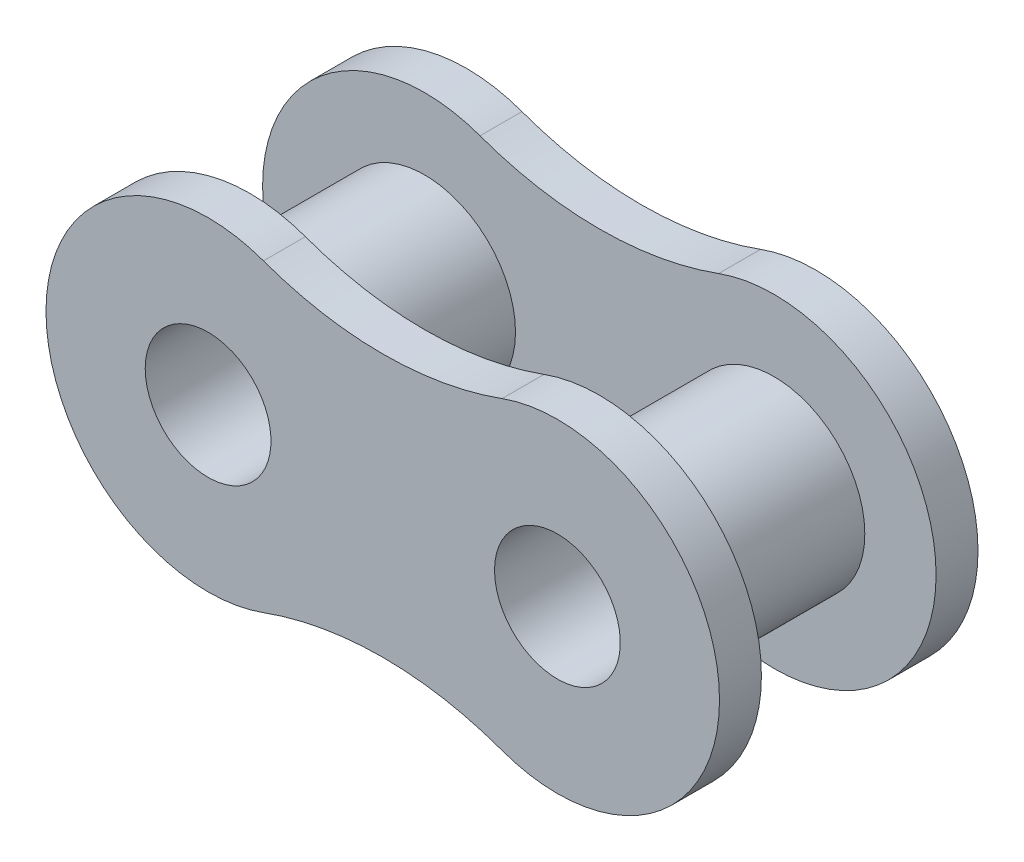
ISO-10303-21;
HEADER;
FILE_DESCRIPTION(('STEP AP214'),'2;1');
FILE_NAME('part.step','',(''),(''),'','','');
FILE_SCHEMA(('AUTOMOTIVE_DESIGN { 1 0 10303 214 1 1 1 1 }'));
ENDSEC;
DATA;
#1=APPLICATION_CONTEXT('core data for automotive mechanical design processes');
#2=APPLICATION_PROTOCOL_DEFINITION('international standard','automotive_design',2000,#1);
#3=PRODUCT_CONTEXT('',#1,'mechanical');
#4=PRODUCT('Part','Part','',(#3));
#5=PRODUCT_RELATED_PRODUCT_CATEGORY('part','',(#4));
#6=PRODUCT_DEFINITION_FORMATION('','',#4);
#7=PRODUCT_DEFINITION_CONTEXT('part definition',#1,'design');
#8=PRODUCT_DEFINITION('design','',#6,#7);
#9=PRODUCT_DEFINITION_SHAPE('','',#8);
#10=(LENGTH_UNIT() NAMED_UNIT(*) SI_UNIT(.MILLI.,.METRE.));
#11=(NAMED_UNIT(*) PLANE_ANGLE_UNIT() SI_UNIT($,.RADIAN.));
#12=(NAMED_UNIT(*) SI_UNIT($,.STERADIAN.) SOLID_ANGLE_UNIT());
#13=UNCERTAINTY_MEASURE_WITH_UNIT(LENGTH_MEASURE(1.E-05),#10,'distance_accuracy_value','');
#14=(GEOMETRIC_REPRESENTATION_CONTEXT(3) GLOBAL_UNCERTAINTY_ASSIGNED_CONTEXT((#13)) GLOBAL_UNIT_ASSIGNED_CONTEXT((#10,
#11,#12)) REPRESENTATION_CONTEXT('',''));
#15=CARTESIAN_POINT('',(0.,0.,0.));
#16=DIRECTION('',(0.,0.,1.));
#17=DIRECTION('',(1.,0.,0.));
#18=AXIS2_PLACEMENT_3D('',#15,#16,#17);
#19=CARTESIAN_POINT('',(-4.7625,-4.36870770251341,1.5875));
#20=DIRECTION('',(0.,0.,1.));
#21=DIRECTION('',(1.,0.,0.));
#22=AXIS2_PLACEMENT_3D('',#19,#20,#21);
#23=PLANE('',#22);
#24=CARTESIAN_POINT('',(0.,0.,1.5875));
#25=DIRECTION('',(0.,0.,1.));
#26=DIRECTION('',(1.,0.,0.));
#27=AXIS2_PLACEMENT_3D('',#24,#25,#26);
#28=CIRCLE('',#27,1.651);
#29=CARTESIAN_POINT('',(1.651,0.,1.5875));
#30=VERTEX_POINT('',#29);
#31=EDGE_CURVE('E221',#30,#30,#28,.F.);
#32=ORIENTED_EDGE('',*,*,#31,.F.);
#33=EDGE_LOOP('',(#32));
#34=FACE_BOUND('',#33,.T.);
#35=CARTESIAN_POINT('',(-3.175,-8.73741540502682,1.5875));
#36=DIRECTION('',(0.,0.,-1.));
#37=DIRECTION('',(1.,0.,0.));
#38=AXIS2_PLACEMENT_3D('',#35,#36,#37);
#39=CIRCLE('',#38,6.35);
#40=CARTESIAN_POINT('',(-5.34371584699454,-2.76923548356041,1.5875));
#41=VERTEX_POINT('',#40);
#42=CARTESIAN_POINT('',(-1.00628415300546,-2.76923548356041,1.5875));
#43=VERTEX_POINT('',#42);
#44=EDGE_CURVE('E188',#41,#43,#39,.T.);
#45=ORIENTED_EDGE('',*,*,#44,.F.);
#46=CARTESIAN_POINT('',(-6.35,0.,1.5875));
#47=DIRECTION('',(0.,0.,1.));
#48=DIRECTION('',(1.,0.,0.));
#49=AXIS2_PLACEMENT_3D('',#46,#47,#48);
#50=CIRCLE('',#49,2.9464);
#51=CARTESIAN_POINT('',(-5.34371584699454,2.76923548356041,1.5875));
#52=VERTEX_POINT('',#51);
#53=EDGE_CURVE('E83',#52,#41,#50,.T.);
#54=ORIENTED_EDGE('',*,*,#53,.F.);
#55=CARTESIAN_POINT('',(-3.175,8.73741540502682,1.5875));
#56=DIRECTION('',(0.,0.,-1.));
#57=DIRECTION('',(1.,0.,0.));
#58=AXIS2_PLACEMENT_3D('',#55,#56,#57);
#59=CIRCLE('',#58,6.35);
#60=CARTESIAN_POINT('',(-1.00628415300547,2.76923548356041,1.5875));
#61=VERTEX_POINT('',#60);
#62=EDGE_CURVE('E77',#61,#52,#59,.T.);
#63=ORIENTED_EDGE('',*,*,#62,.F.);
#64=CARTESIAN_POINT('',(0.,0.,1.5875));
#65=DIRECTION('',(0.,0.,1.));
#66=DIRECTION('',(1.,0.,0.));
#67=AXIS2_PLACEMENT_3D('',#64,#65,#66);
#68=CIRCLE('',#67,2.9464);
#69=EDGE_CURVE('E203',#43,#61,#68,.T.);
#70=ORIENTED_EDGE('',*,*,#69,.F.);
#71=EDGE_LOOP('',(#45,#54,#63,#70));
#72=FACE_BOUND('',#71,.T.);
#73=CARTESIAN_POINT('',(-6.35,0.,1.5875));
#74=DIRECTION('',(0.,0.,1.));
#75=DIRECTION('',(1.,0.,0.));
#76=AXIS2_PLACEMENT_3D('',#73,#74,#75);
#77=CIRCLE('',#76,1.651);
#78=CARTESIAN_POINT('',(-4.699,0.,1.5875));
#79=VERTEX_POINT('',#78);
#80=EDGE_CURVE('E11',#79,#79,#77,.F.);
#81=ORIENTED_EDGE('',*,*,#80,.F.);
#82=EDGE_LOOP('',(#81));
#83=FACE_BOUND('',#82,.T.);
#84=ADVANCED_FACE('F41',(#34,#72,#83),#23,.F.);
#85=CARTESIAN_POINT('',(-4.7625,-4.36870770251341,-1.5875));
#86=DIRECTION('',(0.,0.,-1.));
#87=DIRECTION('',(1.,0.,0.));
#88=AXIS2_PLACEMENT_3D('',#85,#86,#87);
#89=PLANE('',#88);
#90=CARTESIAN_POINT('',(0.,0.,-1.5875));
#91=DIRECTION('',(0.,0.,-1.));
#92=DIRECTION('',(-1.,0.,0.));
#93=AXIS2_PLACEMENT_3D('',#90,#91,#92);
#94=CIRCLE('',#93,1.651);
#95=CARTESIAN_POINT('',(-1.651,0.,-1.5875));
#96=VERTEX_POINT('',#95);
#97=EDGE_CURVE('E130',#96,#96,#94,.T.);
#98=ORIENTED_EDGE('',*,*,#97,.T.);
#99=EDGE_LOOP('',(#98));
#100=FACE_BOUND('',#99,.T.);
#101=CARTESIAN_POINT('',(-3.175,-8.73741540502682,-1.5875));
#102=DIRECTION('',(0.,0.,-1.));
#103=DIRECTION('',(1.,0.,0.));
#104=AXIS2_PLACEMENT_3D('',#101,#102,#103);
#105=CIRCLE('',#104,6.35);
#106=CARTESIAN_POINT('',(-5.34371584699454,-2.76923548356041,-1.5875));
#107=VERTEX_POINT('',#106);
#108=CARTESIAN_POINT('',(-1.00628415300546,-2.76923548356041,-1.5875));
#109=VERTEX_POINT('',#108);
#110=EDGE_CURVE('E162',#107,#109,#105,.T.);
#111=ORIENTED_EDGE('',*,*,#110,.T.);
#112=CARTESIAN_POINT('',(0.,0.,-1.5875));
#113=DIRECTION('',(0.,0.,1.));
#114=DIRECTION('',(1.,0.,0.));
#115=AXIS2_PLACEMENT_3D('',#112,#113,#114);
#116=CIRCLE('',#115,2.9464);
#117=CARTESIAN_POINT('',(-1.00628415300547,2.76923548356041,-1.5875));
#118=VERTEX_POINT('',#117);
#119=EDGE_CURVE('E124',#109,#118,#116,.T.);
#120=ORIENTED_EDGE('',*,*,#119,.T.);
#121=CARTESIAN_POINT('',(-3.175,8.73741540502682,-1.5875));
#122=DIRECTION('',(0.,0.,-1.));
#123=DIRECTION('',(1.,0.,0.));
#124=AXIS2_PLACEMENT_3D('',#121,#122,#123);
#125=CIRCLE('',#124,6.35);
#126=CARTESIAN_POINT('',(-5.34371584699454,2.76923548356041,-1.5875));
#127=VERTEX_POINT('',#126);
#128=EDGE_CURVE('E151',#118,#127,#125,.T.);
#129=ORIENTED_EDGE('',*,*,#128,.T.);
#130=CARTESIAN_POINT('',(-6.35,0.,-1.5875));
#131=DIRECTION('',(0.,0.,1.));
#132=DIRECTION('',(1.,0.,0.));
#133=AXIS2_PLACEMENT_3D('',#130,#131,#132);
#134=CIRCLE('',#133,2.9464);
#135=EDGE_CURVE('E147',#127,#107,#134,.T.);
#136=ORIENTED_EDGE('',*,*,#135,.T.);
#137=EDGE_LOOP('',(#111,#120,#129,#136));
#138=FACE_BOUND('',#137,.T.);
#139=CARTESIAN_POINT('',(-6.35,0.,-1.5875));
#140=DIRECTION('',(0.,0.,-1.));
#141=DIRECTION('',(-1.,0.,0.));
#142=AXIS2_PLACEMENT_3D('',#139,#140,#141);
#143=CIRCLE('',#142,1.651);
#144=CARTESIAN_POINT('',(-8.001,0.,-1.5875));
#145=VERTEX_POINT('',#144);
#146=EDGE_CURVE('E51',#145,#145,#143,.F.);
#147=ORIENTED_EDGE('',*,*,#146,.F.);
#148=EDGE_LOOP('',(#147));
#149=FACE_BOUND('',#148,.T.);
#150=ADVANCED_FACE('F230',(#100,#138,#149),#89,.F.);
#151=CARTESIAN_POINT('',(-4.7625,-4.36870770251341,2.3495));
#152=DIRECTION('',(0.,0.,1.));
#153=DIRECTION('',(1.,0.,0.));
#154=AXIS2_PLACEMENT_3D('',#151,#152,#153);
#155=PLANE('',#154);
#156=CARTESIAN_POINT('',(0.,0.,2.3495));
#157=DIRECTION('',(0.,0.,1.));
#158=DIRECTION('',(1.,0.,0.));
#159=AXIS2_PLACEMENT_3D('',#156,#157,#158);
#160=CIRCLE('',#159,1.143);
#161=CARTESIAN_POINT('',(-1.143,0.,2.3495));
#162=VERTEX_POINT('',#161);
#163=EDGE_CURVE('E184',#162,#162,#160,.T.);
#164=ORIENTED_EDGE('',*,*,#163,.F.);
#165=EDGE_LOOP('',(#164));
#166=FACE_BOUND('',#165,.T.);
#167=CARTESIAN_POINT('',(-3.175,-8.73741540502682,2.3495));
#168=DIRECTION('',(0.,0.,-1.));
#169=DIRECTION('',(1.,0.,0.));
#170=AXIS2_PLACEMENT_3D('',#167,#168,#169);
#171=CIRCLE('',#170,6.35);
#172=CARTESIAN_POINT('',(-5.34371584699454,-2.76923548356041,2.3495));
#173=VERTEX_POINT('',#172);
#174=CARTESIAN_POINT('',(-1.00628415300546,-2.76923548356041,2.3495));
#175=VERTEX_POINT('',#174);
#176=EDGE_CURVE('E189',#173,#175,#171,.T.);
#177=ORIENTED_EDGE('',*,*,#176,.T.);
#178=CARTESIAN_POINT('',(0.,0.,2.3495));
#179=DIRECTION('',(0.,0.,1.));
#180=DIRECTION('',(1.,0.,0.));
#181=AXIS2_PLACEMENT_3D('',#178,#179,#180);
#182=CIRCLE('',#181,2.9464);
#183=CARTESIAN_POINT('',(-1.00628415300547,2.76923548356041,2.3495));
#184=VERTEX_POINT('',#183);
#185=EDGE_CURVE('E91',#175,#184,#182,.T.);
#186=ORIENTED_EDGE('',*,*,#185,.T.);
#187=CARTESIAN_POINT('',(-3.175,8.73741540502682,2.3495));
#188=DIRECTION('',(0.,0.,-1.));
#189=DIRECTION('',(1.,0.,0.));
#190=AXIS2_PLACEMENT_3D('',#187,#188,#189);
#191=CIRCLE('',#190,6.35);
#192=CARTESIAN_POINT('',(-5.34371584699454,2.76923548356041,2.3495));
#193=VERTEX_POINT('',#192);
#194=EDGE_CURVE('E194',#184,#193,#191,.T.);
#195=ORIENTED_EDGE('',*,*,#194,.T.);
#196=CARTESIAN_POINT('',(-6.35,0.,2.3495));
#197=DIRECTION('',(0.,0.,1.));
#198=DIRECTION('',(1.,0.,0.));
#199=AXIS2_PLACEMENT_3D('',#196,#197,#198);
#200=CIRCLE('',#199,2.9464);
#201=EDGE_CURVE('E59',#193,#173,#200,.T.);
#202=ORIENTED_EDGE('',*,*,#201,.T.);
#203=EDGE_LOOP('',(#177,#186,#195,#202));
#204=FACE_BOUND('',#203,.T.);
#205=CARTESIAN_POINT('',(-6.35,0.,2.3495));
#206=DIRECTION('',(0.,0.,1.));
#207=DIRECTION('',(1.,0.,0.));
#208=AXIS2_PLACEMENT_3D('',#205,#206,#207);
#209=CIRCLE('',#208,1.143);
#210=CARTESIAN_POINT('',(-7.493,0.,2.3495));
#211=VERTEX_POINT('',#210);
#212=EDGE_CURVE('E180',#211,#211,#209,.T.);
#213=ORIENTED_EDGE('',*,*,#212,.F.);
#214=EDGE_LOOP('',(#213));
#215=FACE_BOUND('',#214,.T.);
#216=ADVANCED_FACE('F232',(#166,#204,#215),#155,.T.);
#217=CARTESIAN_POINT('',(-3.175,-8.73741540502682,2.3495));
#218=DIRECTION('',(0.,0.,-1.));
#219=DIRECTION('',(-1.,0.,0.));
#220=AXIS2_PLACEMENT_3D('',#217,#218,#219);
#221=CYLINDRICAL_SURFACE('',#220,6.35);
#222=ORIENTED_EDGE('',*,*,#44,.T.);
#223=DIRECTION('',(0.,0.,-1.));
#224=VECTOR('',#223,1.);
#225=CARTESIAN_POINT('',(-1.00628415300546,-2.76923548356041,2.3495));
#226=LINE('',#225,#224);
#227=EDGE_CURVE('E218',#175,#43,#226,.T.);
#228=ORIENTED_EDGE('',*,*,#227,.F.);
#229=ORIENTED_EDGE('',*,*,#176,.F.);
#230=DIRECTION('',(0.,0.,-1.));
#231=VECTOR('',#230,1.);
#232=CARTESIAN_POINT('',(-5.34371584699454,-2.76923548356041,2.3495));
#233=LINE('',#232,#231);
#234=EDGE_CURVE('E199',#173,#41,#233,.T.);
#235=ORIENTED_EDGE('',*,*,#234,.T.);
#236=EDGE_LOOP('',(#222,#228,#229,#235));
#237=FACE_BOUND('',#236,.T.);
#238=ADVANCED_FACE('F43',(#237),#221,.F.);
#239=CARTESIAN_POINT('',(0.,0.,2.3495));
#240=DIRECTION('',(0.,0.,-1.));
#241=DIRECTION('',(-1.,0.,0.));
#242=AXIS2_PLACEMENT_3D('',#239,#240,#241);
#243=CYLINDRICAL_SURFACE('',#242,2.9464);
#244=ORIENTED_EDGE('',*,*,#69,.T.);
#245=DIRECTION('',(0.,0.,-1.));
#246=VECTOR('',#245,1.);
#247=CARTESIAN_POINT('',(-1.00628415300547,2.76923548356041,2.3495));
#248=LINE('',#247,#246);
#249=EDGE_CURVE('E215',#184,#61,#248,.T.);
#250=ORIENTED_EDGE('',*,*,#249,.F.);
#251=ORIENTED_EDGE('',*,*,#185,.F.);
#252=ORIENTED_EDGE('',*,*,#227,.T.);
#253=EDGE_LOOP('',(#244,#250,#251,#252));
#254=FACE_BOUND('',#253,.T.);
#255=ADVANCED_FACE('F276',(#254),#243,.T.);
#256=CARTESIAN_POINT('',(-3.175,8.73741540502682,2.3495));
#257=DIRECTION('',(0.,0.,-1.));
#258=DIRECTION('',(-1.,0.,0.));
#259=AXIS2_PLACEMENT_3D('',#256,#257,#258);
#260=CYLINDRICAL_SURFACE('',#259,6.35);
#261=ORIENTED_EDGE('',*,*,#62,.T.);
#262=DIRECTION('',(0.,0.,-1.));
#263=VECTOR('',#262,1.);
#264=CARTESIAN_POINT('',(-5.34371584699454,2.76923548356041,2.3495));
#265=LINE('',#264,#263);
#266=EDGE_CURVE('E212',#193,#52,#265,.T.);
#267=ORIENTED_EDGE('',*,*,#266,.F.);
#268=ORIENTED_EDGE('',*,*,#194,.F.);
#269=ORIENTED_EDGE('',*,*,#249,.T.);
#270=EDGE_LOOP('',(#261,#267,#268,#269));
#271=FACE_BOUND('',#270,.T.);
#272=ADVANCED_FACE('F274',(#271),#260,.F.);
#273=CARTESIAN_POINT('',(-6.35,0.,2.3495));
#274=DIRECTION('',(0.,0.,-1.));
#275=DIRECTION('',(-1.,0.,0.));
#276=AXIS2_PLACEMENT_3D('',#273,#274,#275);
#277=CYLINDRICAL_SURFACE('',#276,2.9464);
#278=ORIENTED_EDGE('',*,*,#53,.T.);
#279=ORIENTED_EDGE('',*,*,#234,.F.);
#280=ORIENTED_EDGE('',*,*,#201,.F.);
#281=ORIENTED_EDGE('',*,*,#266,.T.);
#282=EDGE_LOOP('',(#278,#279,#280,#281));
#283=FACE_BOUND('',#282,.T.);
#284=ADVANCED_FACE('F269',(#283),#277,.T.);
#285=CARTESIAN_POINT('',(0.,0.,2.3495));
#286=DIRECTION('',(0.,0.,-1.));
#287=DIRECTION('',(-1.,0.,0.));
#288=AXIS2_PLACEMENT_3D('',#285,#286,#287);
#289=CYLINDRICAL_SURFACE('',#288,1.143);
#290=CARTESIAN_POINT('',(0.,0.,-2.3495));
#291=DIRECTION('',(0.,0.,1.));
#292=DIRECTION('',(1.,0.,0.));
#293=AXIS2_PLACEMENT_3D('',#290,#291,#292);
#294=CIRCLE('',#293,1.143);
#295=CARTESIAN_POINT('',(-1.143,0.,-2.3495));
#296=VERTEX_POINT('',#295);
#297=EDGE_CURVE('E154',#296,#296,#294,.T.);
#298=CARTESIAN_POINT('',(-1.143,0.,2.3495));
#299=CARTESIAN_POINT('',(-1.143,0.,2.30055208333333));
#300=CARTESIAN_POINT('',(-1.143,0.,2.25160416666667));
#301=CARTESIAN_POINT('',(-1.143,0.,2.15370833333333));
#302=CARTESIAN_POINT('',(-1.143,0.,2.10476041666667));
#303=CARTESIAN_POINT('',(-1.143,0.,2.00686458333333));
#304=CARTESIAN_POINT('',(-1.143,0.,1.95791666666667));
#305=CARTESIAN_POINT('',(-1.143,0.,1.86002083333333));
#306=CARTESIAN_POINT('',(-1.143,0.,1.81107291666667));
#307=CARTESIAN_POINT('',(-1.143,0.,1.71317708333333));
#308=CARTESIAN_POINT('',(-1.143,0.,1.66422916666667));
#309=CARTESIAN_POINT('',(-1.143,0.,1.56633333333333));
#310=CARTESIAN_POINT('',(-1.143,0.,1.51738541666667));
#311=CARTESIAN_POINT('',(-1.143,0.,1.41948958333333));
#312=CARTESIAN_POINT('',(-1.143,0.,1.37054166666667));
#313=CARTESIAN_POINT('',(-1.143,0.,1.27264583333333));
#314=CARTESIAN_POINT('',(-1.143,0.,1.22369791666667));
#315=CARTESIAN_POINT('',(-1.143,0.,1.12580208333333));
#316=CARTESIAN_POINT('',(-1.143,0.,1.07685416666667));
#317=CARTESIAN_POINT('',(-1.143,0.,0.978958333333333));
#318=CARTESIAN_POINT('',(-1.143,0.,0.930010416666666));
#319=CARTESIAN_POINT('',(-1.143,0.,0.832114583333333));
#320=CARTESIAN_POINT('',(-1.143,0.,0.783166666666666));
#321=CARTESIAN_POINT('',(-1.143,0.,0.685270833333333));
#322=CARTESIAN_POINT('',(-1.143,0.,0.636322916666666));
#323=CARTESIAN_POINT('',(-1.143,0.,0.538427083333333));
#324=CARTESIAN_POINT('',(-1.143,0.,0.489479166666666));
#325=CARTESIAN_POINT('',(-1.143,0.,0.391583333333333));
#326=CARTESIAN_POINT('',(-1.143,0.,0.342635416666666));
#327=CARTESIAN_POINT('',(-1.143,0.,0.244739583333333));
#328=CARTESIAN_POINT('',(-1.143,0.,0.195791666666666));
#329=CARTESIAN_POINT('',(-1.143,0.,0.0978958333333327));
#330=CARTESIAN_POINT('',(-1.143,0.,0.0489479166666659));
#331=CARTESIAN_POINT('',(-1.143,0.,-0.0489479166666676));
#332=CARTESIAN_POINT('',(-1.143,0.,-0.0978958333333344));
#333=CARTESIAN_POINT('',(-1.143,0.,-0.195791666666668));
#334=CARTESIAN_POINT('',(-1.143,0.,-0.244739583333334));
#335=CARTESIAN_POINT('',(-1.143,0.,-0.342635416666668));
#336=CARTESIAN_POINT('',(-1.143,0.,-0.391583333333334));
#337=CARTESIAN_POINT('',(-1.143,0.,-0.489479166666668));
#338=CARTESIAN_POINT('',(-1.143,0.,-0.538427083333334));
#339=CARTESIAN_POINT('',(-1.143,0.,-0.636322916666668));
#340=CARTESIAN_POINT('',(-1.143,0.,-0.685270833333335));
#341=CARTESIAN_POINT('',(-1.143,0.,-0.783166666666668));
#342=CARTESIAN_POINT('',(-1.143,0.,-0.832114583333335));
#343=CARTESIAN_POINT('',(-1.143,0.,-0.930010416666668));
#344=CARTESIAN_POINT('',(-1.143,0.,-0.978958333333334));
#345=CARTESIAN_POINT('',(-1.143,0.,-1.07685416666667));
#346=CARTESIAN_POINT('',(-1.143,0.,-1.12580208333333));
#347=CARTESIAN_POINT('',(-1.143,0.,-1.22369791666667));
#348=CARTESIAN_POINT('',(-1.143,0.,-1.27264583333333));
#349=CARTESIAN_POINT('',(-1.143,0.,-1.37054166666667));
#350=CARTESIAN_POINT('',(-1.143,0.,-1.41948958333333));
#351=CARTESIAN_POINT('',(-1.143,0.,-1.51738541666667));
#352=CARTESIAN_POINT('',(-1.143,0.,-1.56633333333333));
#353=CARTESIAN_POINT('',(-1.143,0.,-1.66422916666667));
#354=CARTESIAN_POINT('',(-1.143,0.,-1.71317708333333));
#355=CARTESIAN_POINT('',(-1.143,0.,-1.81107291666667));
#356=CARTESIAN_POINT('',(-1.143,0.,-1.86002083333333));
#357=CARTESIAN_POINT('',(-1.143,0.,-1.95791666666667));
#358=CARTESIAN_POINT('',(-1.143,0.,-2.00686458333333));
#359=CARTESIAN_POINT('',(-1.143,0.,-2.10476041666667));
#360=CARTESIAN_POINT('',(-1.143,0.,-2.15370833333333));
#361=CARTESIAN_POINT('',(-1.143,0.,-2.25160416666667));
#362=CARTESIAN_POINT('',(-1.143,0.,-2.30055208333333));
#363=CARTESIAN_POINT('',(-1.143,0.,-2.3495));
#364=B_SPLINE_CURVE_WITH_KNOTS('',3,(#298,#299,#300,#301,#302,#303,#304,#305,#306,#307,#308,
#309,#310,#311,#312,#313,#314,#315,#316,#317,#318,#319,#320,#321,#322,#323,#324,#325,#326,#327,
#328,#329,#330,#331,#332,#333,#334,#335,#336,#337,#338,#339,#340,#341,#342,#343,#344,#345,#346,
#347,#348,#349,#350,#351,#352,#353,#354,#355,#356,#357,#358,#359,#360,#361,#362,#363),
.UNSPECIFIED.,.F.,.F.,(4,2,2,2,2,2,2,2,2,2,2,2,2,2,2,2,2,2,2,2,2,2,2,2,2,2,2,2,2,2,2,2,4),(0.,
0.14684375,0.2936875,0.44053125,0.587375,0.73421875,0.8810625,1.02790625,1.17475,1.32159375,
1.4684375,1.61528125,1.762125,1.90896875,2.0558125,2.20265625,2.3495,2.49634375,2.6431875,
2.79003125,2.936875,3.08371875,3.2305625,3.37740625,3.52425,3.67109375,3.8179375,3.96478125,
4.111625,4.25846875,4.4053125,4.55215625,4.699),.UNSPECIFIED.);
#365=EDGE_CURVE('BSEAM266',#162,#296,#364,.T.);
#366=ORIENTED_EDGE('',*,*,#163,.T.);
#367=ORIENTED_EDGE('',*,*,#297,.F.);
#368=ORIENTED_EDGE('',*,*,#365,.T.);
#369=ORIENTED_EDGE('',*,*,#365,.F.);
#370=EDGE_LOOP('',(#366,#368,#367,#369));
#371=FACE_BOUND('',#370,.T.);
#372=ADVANCED_FACE('F266',(#371),#289,.F.);
#373=CARTESIAN_POINT('',(-6.35,0.,2.3495));
#374=DIRECTION('',(0.,0.,-1.));
#375=DIRECTION('',(-1.,0.,0.));
#376=AXIS2_PLACEMENT_3D('',#373,#374,#375);
#377=CYLINDRICAL_SURFACE('',#376,1.143);
#378=CARTESIAN_POINT('',(-6.35,0.,-2.3495));
#379=DIRECTION('',(0.,0.,1.));
#380=DIRECTION('',(1.,0.,0.));
#381=AXIS2_PLACEMENT_3D('',#378,#379,#380);
#382=CIRCLE('',#381,1.143);
#383=CARTESIAN_POINT('',(-7.493,0.,-2.3495));
#384=VERTEX_POINT('',#383);
#385=EDGE_CURVE('E293',#384,#384,#382,.T.);
#386=CARTESIAN_POINT('',(-7.493,0.,2.3495));
#387=CARTESIAN_POINT('',(-7.493,0.,2.30055208333333));
#388=CARTESIAN_POINT('',(-7.493,0.,2.25160416666667));
#389=CARTESIAN_POINT('',(-7.493,0.,2.15370833333333));
#390=CARTESIAN_POINT('',(-7.493,0.,2.10476041666667));
#391=CARTESIAN_POINT('',(-7.493,0.,2.00686458333333));
#392=CARTESIAN_POINT('',(-7.493,0.,1.95791666666667));
#393=CARTESIAN_POINT('',(-7.493,0.,1.86002083333333));
#394=CARTESIAN_POINT('',(-7.493,0.,1.81107291666667));
#395=CARTESIAN_POINT('',(-7.493,0.,1.71317708333333));
#396=CARTESIAN_POINT('',(-7.493,0.,1.66422916666667));
#397=CARTESIAN_POINT('',(-7.493,0.,1.56633333333333));
#398=CARTESIAN_POINT('',(-7.493,0.,1.51738541666667));
#399=CARTESIAN_POINT('',(-7.493,0.,1.41948958333333));
#400=CARTESIAN_POINT('',(-7.493,0.,1.37054166666667));
#401=CARTESIAN_POINT('',(-7.493,0.,1.27264583333333));
#402=CARTESIAN_POINT('',(-7.493,0.,1.22369791666667));
#403=CARTESIAN_POINT('',(-7.493,0.,1.12580208333333));
#404=CARTESIAN_POINT('',(-7.493,0.,1.07685416666667));
#405=CARTESIAN_POINT('',(-7.493,0.,0.978958333333333));
#406=CARTESIAN_POINT('',(-7.493,0.,0.930010416666666));
#407=CARTESIAN_POINT('',(-7.493,0.,0.832114583333333));
#408=CARTESIAN_POINT('',(-7.493,0.,0.783166666666666));
#409=CARTESIAN_POINT('',(-7.493,0.,0.685270833333333));
#410=CARTESIAN_POINT('',(-7.493,0.,0.636322916666666));
#411=CARTESIAN_POINT('',(-7.493,0.,0.538427083333333));
#412=CARTESIAN_POINT('',(-7.493,0.,0.489479166666666));
#413=CARTESIAN_POINT('',(-7.493,0.,0.391583333333333));
#414=CARTESIAN_POINT('',(-7.493,0.,0.342635416666666));
#415=CARTESIAN_POINT('',(-7.493,0.,0.244739583333333));
#416=CARTESIAN_POINT('',(-7.493,0.,0.195791666666666));
#417=CARTESIAN_POINT('',(-7.493,0.,0.0978958333333327));
#418=CARTESIAN_POINT('',(-7.493,0.,0.0489479166666659));
#419=CARTESIAN_POINT('',(-7.493,0.,-0.0489479166666676));
#420=CARTESIAN_POINT('',(-7.493,0.,-0.0978958333333344));
#421=CARTESIAN_POINT('',(-7.493,0.,-0.195791666666668));
#422=CARTESIAN_POINT('',(-7.493,0.,-0.244739583333334));
#423=CARTESIAN_POINT('',(-7.493,0.,-0.342635416666668));
#424=CARTESIAN_POINT('',(-7.493,0.,-0.391583333333334));
#425=CARTESIAN_POINT('',(-7.493,0.,-0.489479166666668));
#426=CARTESIAN_POINT('',(-7.493,0.,-0.538427083333334));
#427=CARTESIAN_POINT('',(-7.493,0.,-0.636322916666668));
#428=CARTESIAN_POINT('',(-7.493,0.,-0.685270833333335));
#429=CARTESIAN_POINT('',(-7.493,0.,-0.783166666666668));
#430=CARTESIAN_POINT('',(-7.493,0.,-0.832114583333335));
#431=CARTESIAN_POINT('',(-7.493,0.,-0.930010416666668));
#432=CARTESIAN_POINT('',(-7.493,0.,-0.978958333333334));
#433=CARTESIAN_POINT('',(-7.493,0.,-1.07685416666667));
#434=CARTESIAN_POINT('',(-7.493,0.,-1.12580208333333));
#435=CARTESIAN_POINT('',(-7.493,0.,-1.22369791666667));
#436=CARTESIAN_POINT('',(-7.493,0.,-1.27264583333333));
#437=CARTESIAN_POINT('',(-7.493,0.,-1.37054166666667));
#438=CARTESIAN_POINT('',(-7.493,0.,-1.41948958333333));
#439=CARTESIAN_POINT('',(-7.493,0.,-1.51738541666667));
#440=CARTESIAN_POINT('',(-7.493,0.,-1.56633333333333));
#441=CARTESIAN_POINT('',(-7.493,0.,-1.66422916666667));
#442=CARTESIAN_POINT('',(-7.493,0.,-1.71317708333333));
#443=CARTESIAN_POINT('',(-7.493,0.,-1.81107291666667));
#444=CARTESIAN_POINT('',(-7.493,0.,-1.86002083333333));
#445=CARTESIAN_POINT('',(-7.493,0.,-1.95791666666667));
#446=CARTESIAN_POINT('',(-7.493,0.,-2.00686458333333));
#447=CARTESIAN_POINT('',(-7.493,0.,-2.10476041666667));
#448=CARTESIAN_POINT('',(-7.493,0.,-2.15370833333333));
#449=CARTESIAN_POINT('',(-7.493,0.,-2.25160416666667));
#450=CARTESIAN_POINT('',(-7.493,0.,-2.30055208333333));
#451=CARTESIAN_POINT('',(-7.493,0.,-2.3495));
#452=B_SPLINE_CURVE_WITH_KNOTS('',3,(#386,#387,#388,#389,#390,#391,#392,#393,#394,#395,#396,
#397,#398,#399,#400,#401,#402,#403,#404,#405,#406,#407,#408,#409,#410,#411,#412,#413,#414,#415,
#416,#417,#418,#419,#420,#421,#422,#423,#424,#425,#426,#427,#428,#429,#430,#431,#432,#433,#434,
#435,#436,#437,#438,#439,#440,#441,#442,#443,#444,#445,#446,#447,#448,#449,#450,#451),
.UNSPECIFIED.,.F.,.F.,(4,2,2,2,2,2,2,2,2,2,2,2,2,2,2,2,2,2,2,2,2,2,2,2,2,2,2,2,2,2,2,2,4),(0.,
0.14684375,0.2936875,0.44053125,0.587375,0.73421875,0.8810625,1.02790625,1.17475,1.32159375,
1.4684375,1.61528125,1.762125,1.90896875,2.0558125,2.20265625,2.3495,2.49634375,2.6431875,
2.79003125,2.936875,3.08371875,3.2305625,3.37740625,3.52425,3.67109375,3.8179375,3.96478125,
4.111625,4.25846875,4.4053125,4.55215625,4.699),.UNSPECIFIED.);
#453=EDGE_CURVE('BSEAM262',#211,#384,#452,.T.);
#454=ORIENTED_EDGE('',*,*,#212,.T.);
#455=ORIENTED_EDGE('',*,*,#385,.F.);
#456=ORIENTED_EDGE('',*,*,#453,.T.);
#457=ORIENTED_EDGE('',*,*,#453,.F.);
#458=EDGE_LOOP('',(#454,#456,#455,#457));
#459=FACE_BOUND('',#458,.T.);
#460=ADVANCED_FACE('F262',(#459),#377,.F.);
#461=CARTESIAN_POINT('',(0.,0.,-6.25723318295596));
#462=DIRECTION('',(0.,0.,1.));
#463=DIRECTION('',(1.,0.,0.));
#464=AXIS2_PLACEMENT_3D('',#461,#462,#463);
#465=CYLINDRICAL_SURFACE('',#464,1.651);
#466=ORIENTED_EDGE('',*,*,#31,.T.);
#467=EDGE_LOOP('',(#466));
#468=FACE_BOUND('',#467,.T.);
#469=ORIENTED_EDGE('',*,*,#97,.F.);
#470=EDGE_LOOP('',(#469));
#471=FACE_BOUND('',#470,.T.);
#472=ADVANCED_FACE('F259',(#468,#471),#465,.T.);
#473=CARTESIAN_POINT('',(-4.7625,-4.36870770251341,-2.3495));
#474=DIRECTION('',(0.,0.,-1.));
#475=DIRECTION('',(1.,0.,0.));
#476=AXIS2_PLACEMENT_3D('',#473,#474,#475);
#477=PLANE('',#476);
#478=ORIENTED_EDGE('',*,*,#297,.T.);
#479=EDGE_LOOP('',(#478));
#480=FACE_BOUND('',#479,.T.);
#481=CARTESIAN_POINT('',(-3.175,-8.73741540502682,-2.3495));
#482=DIRECTION('',(0.,0.,-1.));
#483=DIRECTION('',(1.,0.,0.));
#484=AXIS2_PLACEMENT_3D('',#481,#482,#483);
#485=CIRCLE('',#484,6.35);
#486=CARTESIAN_POINT('',(-5.34371584699454,-2.76923548356041,-2.3495));
#487=VERTEX_POINT('',#486);
#488=CARTESIAN_POINT('',(-1.00628415300546,-2.76923548356041,-2.3495));
#489=VERTEX_POINT('',#488);
#490=EDGE_CURVE('E138',#487,#489,#485,.T.);
#491=ORIENTED_EDGE('',*,*,#490,.F.);
#492=CARTESIAN_POINT('',(-6.35,0.,-2.3495));
#493=DIRECTION('',(0.,0.,1.));
#494=DIRECTION('',(1.,0.,0.));
#495=AXIS2_PLACEMENT_3D('',#492,#493,#494);
#496=CIRCLE('',#495,2.9464);
#497=CARTESIAN_POINT('',(-5.34371584699454,2.76923548356041,-2.3495));
#498=VERTEX_POINT('',#497);
#499=EDGE_CURVE('E159',#498,#487,#496,.T.);
#500=ORIENTED_EDGE('',*,*,#499,.F.);
#501=CARTESIAN_POINT('',(-3.175,8.73741540502682,-2.3495));
#502=DIRECTION('',(0.,0.,-1.));
#503=DIRECTION('',(1.,0.,0.));
#504=AXIS2_PLACEMENT_3D('',#501,#502,#503);
#505=CIRCLE('',#504,6.35);
#506=CARTESIAN_POINT('',(-1.00628415300547,2.76923548356041,-2.3495));
#507=VERTEX_POINT('',#506);
#508=EDGE_CURVE('E140',#507,#498,#505,.T.);
#509=ORIENTED_EDGE('',*,*,#508,.F.);
#510=CARTESIAN_POINT('',(0.,0.,-2.3495));
#511=DIRECTION('',(0.,0.,1.));
#512=DIRECTION('',(1.,0.,0.));
#513=AXIS2_PLACEMENT_3D('',#510,#511,#512);
#514=CIRCLE('',#513,2.9464);
#515=EDGE_CURVE('E121',#489,#507,#514,.T.);
#516=ORIENTED_EDGE('',*,*,#515,.F.);
#517=EDGE_LOOP('',(#491,#500,#509,#516));
#518=FACE_BOUND('',#517,.T.);
#519=ORIENTED_EDGE('',*,*,#385,.T.);
#520=EDGE_LOOP('',(#519));
#521=FACE_BOUND('',#520,.T.);
#522=ADVANCED_FACE('F135',(#480,#518,#521),#477,.T.);
#523=CARTESIAN_POINT('',(-3.175,-8.73741540502682,-2.3495));
#524=DIRECTION('',(0.,0.,1.));
#525=DIRECTION('',(-1.,0.,0.));
#526=AXIS2_PLACEMENT_3D('',#523,#524,#525);
#527=CYLINDRICAL_SURFACE('',#526,6.35);
#528=ORIENTED_EDGE('',*,*,#110,.F.);
#529=DIRECTION('',(0.,0.,1.));
#530=VECTOR('',#529,1.);
#531=CARTESIAN_POINT('',(-5.34371584699454,-2.76923548356041,-2.3495));
#532=LINE('',#531,#530);
#533=EDGE_CURVE('E144',#487,#107,#532,.T.);
#534=ORIENTED_EDGE('',*,*,#533,.F.);
#535=ORIENTED_EDGE('',*,*,#490,.T.);
#536=DIRECTION('',(0.,0.,1.));
#537=VECTOR('',#536,1.);
#538=CARTESIAN_POINT('',(-1.00628415300546,-2.76923548356041,-2.3495));
#539=LINE('',#538,#537);
#540=EDGE_CURVE('E118',#489,#109,#539,.T.);
#541=ORIENTED_EDGE('',*,*,#540,.T.);
#542=EDGE_LOOP('',(#528,#534,#535,#541));
#543=FACE_BOUND('',#542,.T.);
#544=ADVANCED_FACE('F143',(#543),#527,.F.);
#545=CARTESIAN_POINT('',(0.,0.,-2.3495));
#546=DIRECTION('',(0.,0.,1.));
#547=DIRECTION('',(-1.,0.,0.));
#548=AXIS2_PLACEMENT_3D('',#545,#546,#547);
#549=CYLINDRICAL_SURFACE('',#548,2.9464);
#550=ORIENTED_EDGE('',*,*,#119,.F.);
#551=ORIENTED_EDGE('',*,*,#540,.F.);
#552=ORIENTED_EDGE('',*,*,#515,.T.);
#553=DIRECTION('',(0.,0.,1.));
#554=VECTOR('',#553,1.);
#555=CARTESIAN_POINT('',(-1.00628415300547,2.76923548356041,-2.3495));
#556=LINE('',#555,#554);
#557=EDGE_CURVE('E131',#507,#118,#556,.T.);
#558=ORIENTED_EDGE('',*,*,#557,.T.);
#559=EDGE_LOOP('',(#550,#551,#552,#558));
#560=FACE_BOUND('',#559,.T.);
#561=ADVANCED_FACE('F120',(#560),#549,.T.);
#562=CARTESIAN_POINT('',(-3.175,8.73741540502682,-2.3495));
#563=DIRECTION('',(0.,0.,1.));
#564=DIRECTION('',(-1.,0.,0.));
#565=AXIS2_PLACEMENT_3D('',#562,#563,#564);
#566=CYLINDRICAL_SURFACE('',#565,6.35);
#567=ORIENTED_EDGE('',*,*,#128,.F.);
#568=ORIENTED_EDGE('',*,*,#557,.F.);
#569=ORIENTED_EDGE('',*,*,#508,.T.);
#570=DIRECTION('',(0.,0.,1.));
#571=VECTOR('',#570,1.);
#572=CARTESIAN_POINT('',(-5.34371584699454,2.76923548356041,-2.3495));
#573=LINE('',#572,#571);
#574=EDGE_CURVE('E172',#498,#127,#573,.T.);
#575=ORIENTED_EDGE('',*,*,#574,.T.);
#576=EDGE_LOOP('',(#567,#568,#569,#575));
#577=FACE_BOUND('',#576,.T.);
#578=ADVANCED_FACE('F250',(#577),#566,.F.);
#579=CARTESIAN_POINT('',(-6.35,0.,-2.3495));
#580=DIRECTION('',(0.,0.,1.));
#581=DIRECTION('',(-1.,0.,0.));
#582=AXIS2_PLACEMENT_3D('',#579,#580,#581);
#583=CYLINDRICAL_SURFACE('',#582,2.9464);
#584=ORIENTED_EDGE('',*,*,#135,.F.);
#585=ORIENTED_EDGE('',*,*,#574,.F.);
#586=ORIENTED_EDGE('',*,*,#499,.T.);
#587=ORIENTED_EDGE('',*,*,#533,.T.);
#588=EDGE_LOOP('',(#584,#585,#586,#587));
#589=FACE_BOUND('',#588,.T.);
#590=ADVANCED_FACE('F247',(#589),#583,.T.);
#591=CARTESIAN_POINT('',(-6.35,0.,-6.25723318295596));
#592=DIRECTION('',(0.,0.,1.));
#593=DIRECTION('',(1.,0.,0.));
#594=AXIS2_PLACEMENT_3D('',#591,#592,#593);
#595=CYLINDRICAL_SURFACE('',#594,1.651);
#596=ORIENTED_EDGE('',*,*,#80,.T.);
#597=EDGE_LOOP('',(#596));
#598=FACE_BOUND('',#597,.T.);
#599=ORIENTED_EDGE('',*,*,#146,.T.);
#600=EDGE_LOOP('',(#599));
#601=FACE_BOUND('',#600,.T.);
#602=ADVANCED_FACE('F228',(#598,#601),#595,.T.);
#603=CLOSED_SHELL('',(#84,#150,#216,#238,#255,#272,#284,#372,#460,#472,#522,#544,#561,#578,#590,#602));
#604=MANIFOLD_SOLID_BREP('B2',#603);
#605=ADVANCED_BREP_SHAPE_REPRESENTATION('',(#18,#604),#14);
#606=SHAPE_DEFINITION_REPRESENTATION(#9,#605);
ENDSEC;
END-ISO-10303-21;
